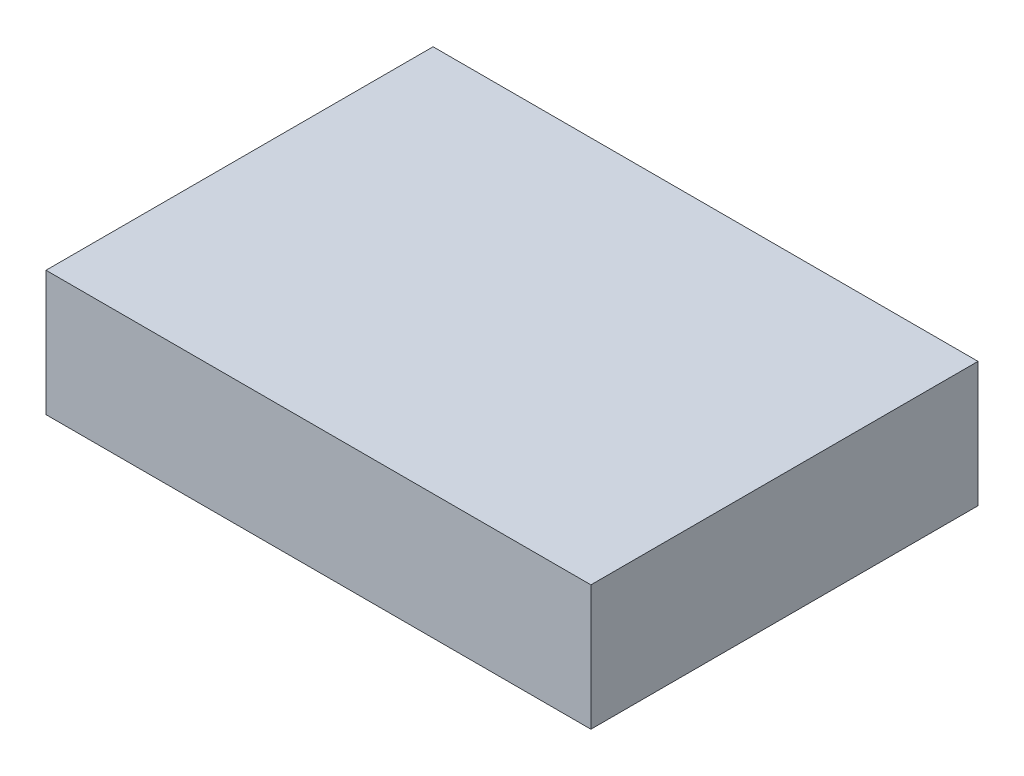
ISO-10303-21;
HEADER;
FILE_DESCRIPTION(('STEP AP214'),'2;1');
FILE_NAME('part.step','',(''),(''),'','','');
FILE_SCHEMA(('AUTOMOTIVE_DESIGN { 1 0 10303 214 1 1 1 1 }'));
ENDSEC;
DATA;
#1=APPLICATION_CONTEXT('core data for automotive mechanical design processes');
#2=APPLICATION_PROTOCOL_DEFINITION('international standard','automotive_design',2000,#1);
#3=PRODUCT_CONTEXT('',#1,'mechanical');
#4=PRODUCT('Part','Part','',(#3));
#5=PRODUCT_RELATED_PRODUCT_CATEGORY('part','',(#4));
#6=PRODUCT_DEFINITION_FORMATION('','',#4);
#7=PRODUCT_DEFINITION_CONTEXT('part definition',#1,'design');
#8=PRODUCT_DEFINITION('design','',#6,#7);
#9=PRODUCT_DEFINITION_SHAPE('','',#8);
#10=(LENGTH_UNIT() NAMED_UNIT(*) SI_UNIT(.MILLI.,.METRE.));
#11=(NAMED_UNIT(*) PLANE_ANGLE_UNIT() SI_UNIT($,.RADIAN.));
#12=(NAMED_UNIT(*) SI_UNIT($,.STERADIAN.) SOLID_ANGLE_UNIT());
#13=UNCERTAINTY_MEASURE_WITH_UNIT(LENGTH_MEASURE(1.E-05),#10,'distance_accuracy_value','');
#14=(GEOMETRIC_REPRESENTATION_CONTEXT(3) GLOBAL_UNCERTAINTY_ASSIGNED_CONTEXT((#13)) GLOBAL_UNIT_ASSIGNED_CONTEXT((#10,
#11,#12)) REPRESENTATION_CONTEXT('',''));
#15=CARTESIAN_POINT('',(0.,0.,0.));
#16=DIRECTION('',(0.,0.,1.));
#17=DIRECTION('',(1.,0.,0.));
#18=AXIS2_PLACEMENT_3D('',#15,#16,#17);
#19=CARTESIAN_POINT('',(457.5,-210.,1.09605888523688E-13));
#20=DIRECTION('',(1.,0.,0.));
#21=DIRECTION('',(0.,0.,-1.));
#22=AXIS2_PLACEMENT_3D('',#19,#20,#21);
#23=PLANE('',#22);
#24=DIRECTION('',(0.,0.,-1.));
#25=VECTOR('',#24,1.);
#26=CARTESIAN_POINT('',(457.5,0.,1.09605888523688E-13));
#27=LINE('',#26,#25);
#28=CARTESIAN_POINT('',(457.5,0.,1.09605888523688E-13));
#29=VERTEX_POINT('',#28);
#30=CARTESIAN_POINT('',(457.5,0.,-650.));
#31=VERTEX_POINT('',#30);
#32=EDGE_CURVE('E96',#29,#31,#27,.T.);
#33=ORIENTED_EDGE('',*,*,#32,.F.);
#34=DIRECTION('',(0.,1.,0.));
#35=VECTOR('',#34,1.);
#36=CARTESIAN_POINT('',(457.5,-210.,1.09605888523688E-13));
#37=LINE('',#36,#35);
#38=CARTESIAN_POINT('',(457.5,-210.,1.09605888523688E-13));
#39=VERTEX_POINT('',#38);
#40=EDGE_CURVE('E11',#39,#29,#37,.T.);
#41=ORIENTED_EDGE('',*,*,#40,.F.);
#42=DIRECTION('',(0.,0.,-1.));
#43=VECTOR('',#42,1.);
#44=CARTESIAN_POINT('',(457.5,-210.,1.09605888523688E-13));
#45=LINE('',#44,#43);
#46=CARTESIAN_POINT('',(457.5,-210.,-650.));
#47=VERTEX_POINT('',#46);
#48=EDGE_CURVE('E90',#39,#47,#45,.T.);
#49=ORIENTED_EDGE('',*,*,#48,.T.);
#50=DIRECTION('',(0.,1.,0.));
#51=VECTOR('',#50,1.);
#52=CARTESIAN_POINT('',(457.5,-210.,-650.));
#53=LINE('',#52,#51);
#54=EDGE_CURVE('E35',#47,#31,#53,.T.);
#55=ORIENTED_EDGE('',*,*,#54,.T.);
#56=EDGE_LOOP('',(#33,#41,#49,#55));
#57=FACE_BOUND('',#56,.T.);
#58=ADVANCED_FACE('F32',(#57),#23,.T.);
#59=CARTESIAN_POINT('',(457.5,-210.,1.09605888523688E-13));
#60=DIRECTION('',(0.,0.,1.));
#61=DIRECTION('',(1.,0.,0.));
#62=AXIS2_PLACEMENT_3D('',#59,#60,#61);
#63=PLANE('',#62);
#64=DIRECTION('',(1.,0.,0.));
#65=VECTOR('',#64,1.);
#66=CARTESIAN_POINT('',(457.5,0.,1.09605888523688E-13));
#67=LINE('',#66,#65);
#68=CARTESIAN_POINT('',(-457.5,0.,1.09605888523688E-13));
#69=VERTEX_POINT('',#68);
#70=EDGE_CURVE('E92',#69,#29,#67,.T.);
#71=ORIENTED_EDGE('',*,*,#70,.F.);
#72=DIRECTION('',(0.,1.,0.));
#73=VECTOR('',#72,1.);
#74=CARTESIAN_POINT('',(-457.5,-210.,1.09605888523688E-13));
#75=LINE('',#74,#73);
#76=CARTESIAN_POINT('',(-457.5,-210.,1.09605888523688E-13));
#77=VERTEX_POINT('',#76);
#78=EDGE_CURVE('E41',#77,#69,#75,.T.);
#79=ORIENTED_EDGE('',*,*,#78,.F.);
#80=DIRECTION('',(1.,0.,0.));
#81=VECTOR('',#80,1.);
#82=CARTESIAN_POINT('',(457.5,-210.,1.09605888523688E-13));
#83=LINE('',#82,#81);
#84=EDGE_CURVE('E87',#77,#39,#83,.T.);
#85=ORIENTED_EDGE('',*,*,#84,.T.);
#86=ORIENTED_EDGE('',*,*,#40,.T.);
#87=EDGE_LOOP('',(#71,#79,#85,#86));
#88=FACE_BOUND('',#87,.T.);
#89=ADVANCED_FACE('F106',(#88),#63,.T.);
#90=CARTESIAN_POINT('',(-457.5,-210.,1.09605888523688E-13));
#91=DIRECTION('',(-1.,0.,0.));
#92=DIRECTION('',(0.,0.,1.));
#93=AXIS2_PLACEMENT_3D('',#90,#91,#92);
#94=PLANE('',#93);
#95=DIRECTION('',(0.,0.,1.));
#96=VECTOR('',#95,1.);
#97=CARTESIAN_POINT('',(-457.5,0.,1.09605888523688E-13));
#98=LINE('',#97,#96);
#99=CARTESIAN_POINT('',(-457.5,0.,-650.));
#100=VERTEX_POINT('',#99);
#101=EDGE_CURVE('E82',#100,#69,#98,.T.);
#102=ORIENTED_EDGE('',*,*,#101,.F.);
#103=DIRECTION('',(0.,1.,0.));
#104=VECTOR('',#103,1.);
#105=CARTESIAN_POINT('',(-457.5,-210.,-650.));
#106=LINE('',#105,#104);
#107=CARTESIAN_POINT('',(-457.5,-210.,-650.));
#108=VERTEX_POINT('',#107);
#109=EDGE_CURVE('E77',#108,#100,#106,.T.);
#110=ORIENTED_EDGE('',*,*,#109,.F.);
#111=DIRECTION('',(0.,0.,1.));
#112=VECTOR('',#111,1.);
#113=CARTESIAN_POINT('',(-457.5,-210.,1.09605888523688E-13));
#114=LINE('',#113,#112);
#115=EDGE_CURVE('E80',#108,#77,#114,.T.);
#116=ORIENTED_EDGE('',*,*,#115,.T.);
#117=ORIENTED_EDGE('',*,*,#78,.T.);
#118=EDGE_LOOP('',(#102,#110,#116,#117));
#119=FACE_BOUND('',#118,.T.);
#120=ADVANCED_FACE('F79',(#119),#94,.T.);
#121=CARTESIAN_POINT('',(457.5,-210.,-650.));
#122=DIRECTION('',(0.,0.,-1.));
#123=DIRECTION('',(-1.,0.,0.));
#124=AXIS2_PLACEMENT_3D('',#121,#122,#123);
#125=PLANE('',#124);
#126=DIRECTION('',(-1.,0.,0.));
#127=VECTOR('',#126,1.);
#128=CARTESIAN_POINT('',(457.5,0.,-650.));
#129=LINE('',#128,#127);
#130=EDGE_CURVE('E99',#31,#100,#129,.T.);
#131=ORIENTED_EDGE('',*,*,#130,.F.);
#132=ORIENTED_EDGE('',*,*,#54,.F.);
#133=DIRECTION('',(-1.,0.,0.));
#134=VECTOR('',#133,1.);
#135=CARTESIAN_POINT('',(457.5,-210.,-650.));
#136=LINE('',#135,#134);
#137=EDGE_CURVE('E86',#47,#108,#136,.T.);
#138=ORIENTED_EDGE('',*,*,#137,.T.);
#139=ORIENTED_EDGE('',*,*,#109,.T.);
#140=EDGE_LOOP('',(#131,#132,#138,#139));
#141=FACE_BOUND('',#140,.T.);
#142=ADVANCED_FACE('F89',(#141),#125,.T.);
#143=CARTESIAN_POINT('',(0.,-210.,0.));
#144=DIRECTION('',(0.,1.,0.));
#145=DIRECTION('',(0.,0.,1.));
#146=AXIS2_PLACEMENT_3D('',#143,#144,#145);
#147=PLANE('',#146);
#148=ORIENTED_EDGE('',*,*,#48,.F.);
#149=ORIENTED_EDGE('',*,*,#84,.F.);
#150=ORIENTED_EDGE('',*,*,#115,.F.);
#151=ORIENTED_EDGE('',*,*,#137,.F.);
#152=EDGE_LOOP('',(#148,#149,#150,#151));
#153=FACE_BOUND('',#152,.T.);
#154=ADVANCED_FACE('F85',(#153),#147,.F.);
#155=CARTESIAN_POINT('',(0.,0.,0.));
#156=DIRECTION('',(0.,1.,0.));
#157=DIRECTION('',(0.,0.,1.));
#158=AXIS2_PLACEMENT_3D('',#155,#156,#157);
#159=PLANE('',#158);
#160=ORIENTED_EDGE('',*,*,#32,.T.);
#161=ORIENTED_EDGE('',*,*,#130,.T.);
#162=ORIENTED_EDGE('',*,*,#101,.T.);
#163=ORIENTED_EDGE('',*,*,#70,.T.);
#164=EDGE_LOOP('',(#160,#161,#162,#163));
#165=FACE_BOUND('',#164,.T.);
#166=ADVANCED_FACE('F105',(#165),#159,.T.);
#167=CLOSED_SHELL('',(#58,#89,#120,#142,#154,#166));
#168=MANIFOLD_SOLID_BREP('B2',#167);
#169=ADVANCED_BREP_SHAPE_REPRESENTATION('',(#18,#168),#14);
#170=SHAPE_DEFINITION_REPRESENTATION(#9,#169);
ENDSEC;
END-ISO-10303-21;
